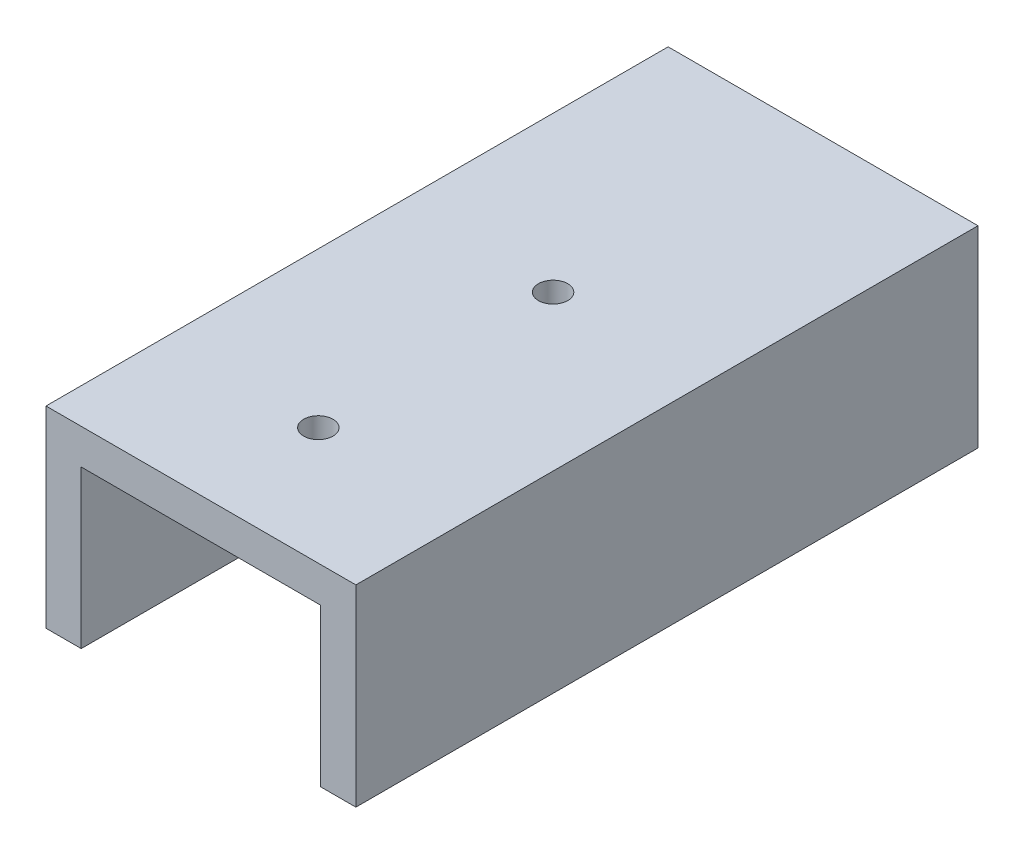
ISO-10303-21;
HEADER;
FILE_DESCRIPTION(('STEP AP214'),'2;1');
FILE_NAME('part.step','',(''),(''),'','','');
FILE_SCHEMA(('AUTOMOTIVE_DESIGN { 1 0 10303 214 1 1 1 1 }'));
ENDSEC;
DATA;
#1=APPLICATION_CONTEXT('core data for automotive mechanical design processes');
#2=APPLICATION_PROTOCOL_DEFINITION('international standard','automotive_design',2000,#1);
#3=PRODUCT_CONTEXT('',#1,'mechanical');
#4=PRODUCT('Part','Part','',(#3));
#5=PRODUCT_RELATED_PRODUCT_CATEGORY('part','',(#4));
#6=PRODUCT_DEFINITION_FORMATION('','',#4);
#7=PRODUCT_DEFINITION_CONTEXT('part definition',#1,'design');
#8=PRODUCT_DEFINITION('design','',#6,#7);
#9=PRODUCT_DEFINITION_SHAPE('','',#8);
#10=(LENGTH_UNIT() NAMED_UNIT(*) SI_UNIT(.MILLI.,.METRE.));
#11=(NAMED_UNIT(*) PLANE_ANGLE_UNIT() SI_UNIT($,.RADIAN.));
#12=(NAMED_UNIT(*) SI_UNIT($,.STERADIAN.) SOLID_ANGLE_UNIT());
#13=UNCERTAINTY_MEASURE_WITH_UNIT(LENGTH_MEASURE(1.E-05),#10,'distance_accuracy_value','');
#14=(GEOMETRIC_REPRESENTATION_CONTEXT(3) GLOBAL_UNCERTAINTY_ASSIGNED_CONTEXT((#13)) GLOBAL_UNIT_ASSIGNED_CONTEXT((#10,
#11,#12)) REPRESENTATION_CONTEXT('',''));
#15=CARTESIAN_POINT('',(0.,0.,0.));
#16=DIRECTION('',(0.,0.,1.));
#17=DIRECTION('',(1.,0.,0.));
#18=AXIS2_PLACEMENT_3D('',#15,#16,#17);
#19=CARTESIAN_POINT('',(0.,0.,50.));
#20=DIRECTION('',(0.,0.,1.));
#21=DIRECTION('',(1.,0.,0.));
#22=AXIS2_PLACEMENT_3D('',#19,#20,#21);
#23=PLANE('',#22);
#24=DIRECTION('',(0.,-1.,0.));
#25=VECTOR('',#24,1.);
#26=CARTESIAN_POINT('',(-13.2,13.2,50.));
#27=LINE('',#26,#25);
#28=CARTESIAN_POINT('',(-13.2,13.2,50.));
#29=VERTEX_POINT('',#28);
#30=CARTESIAN_POINT('',(-13.2,-3.2,50.));
#31=VERTEX_POINT('',#30);
#32=EDGE_CURVE('E146',#29,#31,#27,.T.);
#33=ORIENTED_EDGE('',*,*,#32,.T.);
#34=DIRECTION('',(-1.,0.,0.));
#35=VECTOR('',#34,1.);
#36=CARTESIAN_POINT('',(-13.2,-3.2,50.));
#37=LINE('',#36,#35);
#38=CARTESIAN_POINT('',(-10.2,-3.2,50.));
#39=VERTEX_POINT('',#38);
#40=EDGE_CURVE('E112',#39,#31,#37,.T.);
#41=ORIENTED_EDGE('',*,*,#40,.F.);
#42=DIRECTION('',(0.,-1.,0.));
#43=VECTOR('',#42,1.);
#44=CARTESIAN_POINT('',(-10.2,10.2,50.));
#45=LINE('',#44,#43);
#46=CARTESIAN_POINT('',(-10.2,10.2,50.));
#47=VERTEX_POINT('',#46);
#48=EDGE_CURVE('E130',#47,#39,#45,.T.);
#49=ORIENTED_EDGE('',*,*,#48,.F.);
#50=DIRECTION('',(-1.,0.,0.));
#51=VECTOR('',#50,1.);
#52=CARTESIAN_POINT('',(-10.2,10.2,50.));
#53=LINE('',#52,#51);
#54=CARTESIAN_POINT('',(10.2,10.2,50.));
#55=VERTEX_POINT('',#54);
#56=EDGE_CURVE('E127',#55,#47,#53,.T.);
#57=ORIENTED_EDGE('',*,*,#56,.F.);
#58=DIRECTION('',(0.,1.,0.));
#59=VECTOR('',#58,1.);
#60=CARTESIAN_POINT('',(10.2,10.2,50.));
#61=LINE('',#60,#59);
#62=CARTESIAN_POINT('',(10.2,-3.2,50.));
#63=VERTEX_POINT('',#62);
#64=EDGE_CURVE('E125',#63,#55,#61,.T.);
#65=ORIENTED_EDGE('',*,*,#64,.F.);
#66=CARTESIAN_POINT('',(13.2,-3.2,50.));
#67=VERTEX_POINT('',#66);
#68=EDGE_CURVE('E164',#67,#63,#37,.T.);
#69=ORIENTED_EDGE('',*,*,#68,.F.);
#70=DIRECTION('',(0.,1.,0.));
#71=VECTOR('',#70,1.);
#72=CARTESIAN_POINT('',(13.2,13.2,50.));
#73=LINE('',#72,#71);
#74=CARTESIAN_POINT('',(13.2,13.2,50.));
#75=VERTEX_POINT('',#74);
#76=EDGE_CURVE('E111',#67,#75,#73,.T.);
#77=ORIENTED_EDGE('',*,*,#76,.T.);
#78=DIRECTION('',(-1.,0.,0.));
#79=VECTOR('',#78,1.);
#80=CARTESIAN_POINT('',(-13.2,13.2,50.));
#81=LINE('',#80,#79);
#82=EDGE_CURVE('E57',#75,#29,#81,.T.);
#83=ORIENTED_EDGE('',*,*,#82,.T.);
#84=EDGE_LOOP('',(#33,#41,#49,#57,#65,#69,#77,#83));
#85=FACE_BOUND('',#84,.T.);
#86=ADVANCED_FACE('F32',(#85),#23,.T.);
#87=CARTESIAN_POINT('',(13.2,13.2,50.));
#88=DIRECTION('',(-1.,0.,0.));
#89=DIRECTION('',(0.,-1.,0.));
#90=AXIS2_PLACEMENT_3D('',#87,#88,#89);
#91=PLANE('',#90);
#92=DIRECTION('',(0.,0.,1.));
#93=VECTOR('',#92,1.);
#94=CARTESIAN_POINT('',(13.2,-3.2,50.));
#95=LINE('',#94,#93);
#96=CARTESIAN_POINT('',(13.2,-3.2,-3.));
#97=VERTEX_POINT('',#96);
#98=EDGE_CURVE('E99',#97,#67,#95,.T.);
#99=ORIENTED_EDGE('',*,*,#98,.F.);
#100=DIRECTION('',(0.,-1.,0.));
#101=VECTOR('',#100,1.);
#102=CARTESIAN_POINT('',(13.2,-13.2,-3.));
#103=LINE('',#102,#101);
#104=CARTESIAN_POINT('',(13.2,13.2,-3.));
#105=VERTEX_POINT('',#104);
#106=EDGE_CURVE('E109',#105,#97,#103,.T.);
#107=ORIENTED_EDGE('',*,*,#106,.F.);
#108=DIRECTION('',(0.,0.,-1.));
#109=VECTOR('',#108,1.);
#110=CARTESIAN_POINT('',(13.2,13.2,50.));
#111=LINE('',#110,#109);
#112=EDGE_CURVE('E11',#75,#105,#111,.T.);
#113=ORIENTED_EDGE('',*,*,#112,.F.);
#114=ORIENTED_EDGE('',*,*,#76,.F.);
#115=EDGE_LOOP('',(#99,#107,#113,#114));
#116=FACE_BOUND('',#115,.T.);
#117=ADVANCED_FACE('F34',(#116),#91,.F.);
#118=CARTESIAN_POINT('',(-13.2,13.2,50.));
#119=DIRECTION('',(1.,0.,0.));
#120=DIRECTION('',(0.,1.,0.));
#121=AXIS2_PLACEMENT_3D('',#118,#119,#120);
#122=PLANE('',#121);
#123=DIRECTION('',(0.,0.,-1.));
#124=VECTOR('',#123,1.);
#125=CARTESIAN_POINT('',(-13.2,-3.2,50.));
#126=LINE('',#125,#124);
#127=CARTESIAN_POINT('',(-13.2,-3.19999999999999,-3.));
#128=VERTEX_POINT('',#127);
#129=EDGE_CURVE('E49',#31,#128,#126,.T.);
#130=ORIENTED_EDGE('',*,*,#129,.F.);
#131=ORIENTED_EDGE('',*,*,#32,.F.);
#132=DIRECTION('',(0.,0.,-1.));
#133=VECTOR('',#132,1.);
#134=CARTESIAN_POINT('',(-13.2,13.2,50.));
#135=LINE('',#134,#133);
#136=CARTESIAN_POINT('',(-13.2,13.2,-3.));
#137=VERTEX_POINT('',#136);
#138=EDGE_CURVE('E41',#29,#137,#135,.T.);
#139=ORIENTED_EDGE('',*,*,#138,.T.);
#140=DIRECTION('',(0.,1.,0.));
#141=VECTOR('',#140,1.);
#142=CARTESIAN_POINT('',(-13.2,13.2,-3.));
#143=LINE('',#142,#141);
#144=EDGE_CURVE('E117',#128,#137,#143,.T.);
#145=ORIENTED_EDGE('',*,*,#144,.F.);
#146=EDGE_LOOP('',(#130,#131,#139,#145));
#147=FACE_BOUND('',#146,.T.);
#148=ADVANCED_FACE('F191',(#147),#122,.F.);
#149=CARTESIAN_POINT('',(10.2,10.2,50.));
#150=DIRECTION('',(-1.,0.,0.));
#151=DIRECTION('',(0.,0.,1.));
#152=AXIS2_PLACEMENT_3D('',#149,#150,#151);
#153=PLANE('',#152);
#154=DIRECTION('',(0.,1.,0.));
#155=VECTOR('',#154,1.);
#156=CARTESIAN_POINT('',(10.2,10.2,0.));
#157=LINE('',#156,#155);
#158=CARTESIAN_POINT('',(10.2,-3.2,0.));
#159=VERTEX_POINT('',#158);
#160=CARTESIAN_POINT('',(10.2,10.2,0.));
#161=VERTEX_POINT('',#160);
#162=EDGE_CURVE('E119',#159,#161,#157,.T.);
#163=ORIENTED_EDGE('',*,*,#162,.F.);
#164=DIRECTION('',(0.,0.,1.));
#165=VECTOR('',#164,1.);
#166=CARTESIAN_POINT('',(10.2,-3.2,50.));
#167=LINE('',#166,#165);
#168=EDGE_CURVE('E121',#159,#63,#167,.T.);
#169=ORIENTED_EDGE('',*,*,#168,.T.);
#170=ORIENTED_EDGE('',*,*,#64,.T.);
#171=DIRECTION('',(0.,0.,-1.));
#172=VECTOR('',#171,1.);
#173=CARTESIAN_POINT('',(10.2,10.2,50.));
#174=LINE('',#173,#172);
#175=EDGE_CURVE('E141',#55,#161,#174,.T.);
#176=ORIENTED_EDGE('',*,*,#175,.T.);
#177=EDGE_LOOP('',(#163,#169,#170,#176));
#178=FACE_BOUND('',#177,.T.);
#179=ADVANCED_FACE('F175',(#178),#153,.T.);
#180=CARTESIAN_POINT('',(-10.2,10.2,50.));
#181=DIRECTION('',(1.,0.,0.));
#182=DIRECTION('',(0.,1.,0.));
#183=AXIS2_PLACEMENT_3D('',#180,#181,#182);
#184=PLANE('',#183);
#185=ORIENTED_EDGE('',*,*,#48,.T.);
#186=DIRECTION('',(0.,0.,-1.));
#187=VECTOR('',#186,1.);
#188=CARTESIAN_POINT('',(-10.2,-3.2,50.));
#189=LINE('',#188,#187);
#190=CARTESIAN_POINT('',(-10.2,-3.2,0.));
#191=VERTEX_POINT('',#190);
#192=EDGE_CURVE('E169',#39,#191,#189,.T.);
#193=ORIENTED_EDGE('',*,*,#192,.T.);
#194=DIRECTION('',(0.,-1.,0.));
#195=VECTOR('',#194,1.);
#196=CARTESIAN_POINT('',(-10.2,10.2,0.));
#197=LINE('',#196,#195);
#198=CARTESIAN_POINT('',(-10.2,10.2,0.));
#199=VERTEX_POINT('',#198);
#200=EDGE_CURVE('E128',#199,#191,#197,.T.);
#201=ORIENTED_EDGE('',*,*,#200,.F.);
#202=DIRECTION('',(0.,0.,-1.));
#203=VECTOR('',#202,1.);
#204=CARTESIAN_POINT('',(-10.2,10.2,50.));
#205=LINE('',#204,#203);
#206=EDGE_CURVE('E133',#47,#199,#205,.T.);
#207=ORIENTED_EDGE('',*,*,#206,.F.);
#208=EDGE_LOOP('',(#185,#193,#201,#207));
#209=FACE_BOUND('',#208,.T.);
#210=ADVANCED_FACE('F186',(#209),#184,.T.);
#211=CARTESIAN_POINT('',(0.,0.,0.));
#212=DIRECTION('',(0.,0.,1.));
#213=DIRECTION('',(1.,0.,0.));
#214=AXIS2_PLACEMENT_3D('',#211,#212,#213);
#215=PLANE('',#214);
#216=ORIENTED_EDGE('',*,*,#200,.T.);
#217=DIRECTION('',(1.,0.,0.));
#218=VECTOR('',#217,1.);
#219=CARTESIAN_POINT('',(0.,-3.2,0.));
#220=LINE('',#219,#218);
#221=EDGE_CURVE('E166',#191,#159,#220,.T.);
#222=ORIENTED_EDGE('',*,*,#221,.T.);
#223=ORIENTED_EDGE('',*,*,#162,.T.);
#224=DIRECTION('',(-1.,0.,0.));
#225=VECTOR('',#224,1.);
#226=CARTESIAN_POINT('',(-10.2,10.2,0.));
#227=LINE('',#226,#225);
#228=EDGE_CURVE('E135',#161,#199,#227,.T.);
#229=ORIENTED_EDGE('',*,*,#228,.T.);
#230=EDGE_LOOP('',(#216,#222,#223,#229));
#231=FACE_BOUND('',#230,.T.);
#232=ADVANCED_FACE('F188',(#231),#215,.T.);
#233=CARTESIAN_POINT('',(0.,0.,-3.));
#234=DIRECTION('',(0.,0.,1.));
#235=DIRECTION('',(1.,0.,0.));
#236=AXIS2_PLACEMENT_3D('',#233,#234,#235);
#237=PLANE('',#236);
#238=DIRECTION('',(1.,0.,0.));
#239=VECTOR('',#238,1.);
#240=CARTESIAN_POINT('',(-13.2,-3.2,-3.));
#241=LINE('',#240,#239);
#242=EDGE_CURVE('E96',#128,#97,#241,.T.);
#243=ORIENTED_EDGE('',*,*,#242,.F.);
#244=ORIENTED_EDGE('',*,*,#144,.T.);
#245=DIRECTION('',(1.,0.,0.));
#246=VECTOR('',#245,1.);
#247=CARTESIAN_POINT('',(13.2,13.2,-3.));
#248=LINE('',#247,#246);
#249=EDGE_CURVE('E116',#137,#105,#248,.T.);
#250=ORIENTED_EDGE('',*,*,#249,.T.);
#251=ORIENTED_EDGE('',*,*,#106,.T.);
#252=EDGE_LOOP('',(#243,#244,#250,#251));
#253=FACE_BOUND('',#252,.T.);
#254=ADVANCED_FACE('F114',(#253),#237,.F.);
#255=CARTESIAN_POINT('',(-13.2,13.2,50.));
#256=DIRECTION('',(0.,-1.,0.));
#257=DIRECTION('',(0.,0.,-1.));
#258=AXIS2_PLACEMENT_3D('',#255,#256,#257);
#259=PLANE('',#258);
#260=CARTESIAN_POINT('',(0.,13.2,20.));
#261=DIRECTION('',(0.,1.,0.));
#262=DIRECTION('',(0.,0.,1.));
#263=AXIS2_PLACEMENT_3D('',#260,#261,#262);
#264=CIRCLE('',#263,1.25);
#265=CARTESIAN_POINT('',(0.,13.2,21.25));
#266=VERTEX_POINT('',#265);
#267=EDGE_CURVE('E151',#266,#266,#264,.T.);
#268=ORIENTED_EDGE('',*,*,#267,.F.);
#269=EDGE_LOOP('',(#268));
#270=FACE_BOUND('',#269,.T.);
#271=CARTESIAN_POINT('',(0.,13.2,40.));
#272=DIRECTION('',(0.,1.,0.));
#273=DIRECTION('',(0.,0.,1.));
#274=AXIS2_PLACEMENT_3D('',#271,#272,#273);
#275=CIRCLE('',#274,1.25);
#276=CARTESIAN_POINT('',(0.,13.2,41.25));
#277=VERTEX_POINT('',#276);
#278=EDGE_CURVE('E156',#277,#277,#275,.T.);
#279=ORIENTED_EDGE('',*,*,#278,.F.);
#280=EDGE_LOOP('',(#279));
#281=FACE_BOUND('',#280,.T.);
#282=ORIENTED_EDGE('',*,*,#112,.T.);
#283=ORIENTED_EDGE('',*,*,#249,.F.);
#284=ORIENTED_EDGE('',*,*,#138,.F.);
#285=ORIENTED_EDGE('',*,*,#82,.F.);
#286=EDGE_LOOP('',(#282,#283,#284,#285));
#287=FACE_BOUND('',#286,.T.);
#288=ADVANCED_FACE('F193',(#270,#281,#287),#259,.F.);
#289=CARTESIAN_POINT('',(-10.2,10.2,50.));
#290=DIRECTION('',(0.,-1.,0.));
#291=DIRECTION('',(0.,0.,-1.));
#292=AXIS2_PLACEMENT_3D('',#289,#290,#291);
#293=PLANE('',#292);
#294=CARTESIAN_POINT('',(0.,10.2,20.));
#295=DIRECTION('',(0.,-1.,0.));
#296=DIRECTION('',(0.,0.,-1.));
#297=AXIS2_PLACEMENT_3D('',#294,#295,#296);
#298=CIRCLE('',#297,1.25);
#299=CARTESIAN_POINT('',(0.,10.2,18.75));
#300=VERTEX_POINT('',#299);
#301=EDGE_CURVE('E36',#300,#300,#298,.T.);
#302=ORIENTED_EDGE('',*,*,#301,.F.);
#303=EDGE_LOOP('',(#302));
#304=FACE_BOUND('',#303,.T.);
#305=CARTESIAN_POINT('',(0.,10.2,40.));
#306=DIRECTION('',(0.,-1.,0.));
#307=DIRECTION('',(0.,0.,-1.));
#308=AXIS2_PLACEMENT_3D('',#305,#306,#307);
#309=CIRCLE('',#308,1.25);
#310=CARTESIAN_POINT('',(0.,10.2,38.75));
#311=VERTEX_POINT('',#310);
#312=EDGE_CURVE('E149',#311,#311,#309,.T.);
#313=ORIENTED_EDGE('',*,*,#312,.F.);
#314=EDGE_LOOP('',(#313));
#315=FACE_BOUND('',#314,.T.);
#316=ORIENTED_EDGE('',*,*,#228,.F.);
#317=ORIENTED_EDGE('',*,*,#175,.F.);
#318=ORIENTED_EDGE('',*,*,#56,.T.);
#319=ORIENTED_EDGE('',*,*,#206,.T.);
#320=EDGE_LOOP('',(#316,#317,#318,#319));
#321=FACE_BOUND('',#320,.T.);
#322=ADVANCED_FACE('F183',(#304,#315,#321),#293,.T.);
#323=CARTESIAN_POINT('',(0.,-3.2,0.));
#324=DIRECTION('',(0.,-1.,0.));
#325=DIRECTION('',(0.,0.,-1.));
#326=AXIS2_PLACEMENT_3D('',#323,#324,#325);
#327=PLANE('',#326);
#328=ORIENTED_EDGE('',*,*,#221,.F.);
#329=ORIENTED_EDGE('',*,*,#192,.F.);
#330=ORIENTED_EDGE('',*,*,#40,.T.);
#331=ORIENTED_EDGE('',*,*,#129,.T.);
#332=ORIENTED_EDGE('',*,*,#242,.T.);
#333=ORIENTED_EDGE('',*,*,#98,.T.);
#334=ORIENTED_EDGE('',*,*,#68,.T.);
#335=ORIENTED_EDGE('',*,*,#168,.F.);
#336=EDGE_LOOP('',(#328,#329,#330,#331,#332,#333,#334,#335));
#337=FACE_BOUND('',#336,.T.);
#338=ADVANCED_FACE('F98',(#337),#327,.T.);
#339=CARTESIAN_POINT('',(0.,3.2,40.));
#340=DIRECTION('',(0.,1.,0.));
#341=DIRECTION('',(0.,0.,1.));
#342=AXIS2_PLACEMENT_3D('',#339,#340,#341);
#343=CYLINDRICAL_SURFACE('',#342,1.25);
#344=ORIENTED_EDGE('',*,*,#312,.T.);
#345=EDGE_LOOP('',(#344));
#346=FACE_BOUND('',#345,.T.);
#347=ORIENTED_EDGE('',*,*,#278,.T.);
#348=EDGE_LOOP('',(#347));
#349=FACE_BOUND('',#348,.T.);
#350=ADVANCED_FACE('F227',(#346,#349),#343,.F.);
#351=CARTESIAN_POINT('',(0.,3.2,20.));
#352=DIRECTION('',(0.,1.,0.));
#353=DIRECTION('',(0.,0.,1.));
#354=AXIS2_PLACEMENT_3D('',#351,#352,#353);
#355=CYLINDRICAL_SURFACE('',#354,1.25);
#356=ORIENTED_EDGE('',*,*,#301,.T.);
#357=EDGE_LOOP('',(#356));
#358=FACE_BOUND('',#357,.T.);
#359=ORIENTED_EDGE('',*,*,#267,.T.);
#360=EDGE_LOOP('',(#359));
#361=FACE_BOUND('',#360,.T.);
#362=ADVANCED_FACE('F230',(#358,#361),#355,.F.);
#363=CLOSED_SHELL('',(#86,#117,#148,#179,#210,#232,#254,#288,#322,#338,#350,#362));
#364=MANIFOLD_SOLID_BREP('B2',#363);
#365=ADVANCED_BREP_SHAPE_REPRESENTATION('',(#18,#364),#14);
#366=SHAPE_DEFINITION_REPRESENTATION(#9,#365);
ENDSEC;
END-ISO-10303-21;
